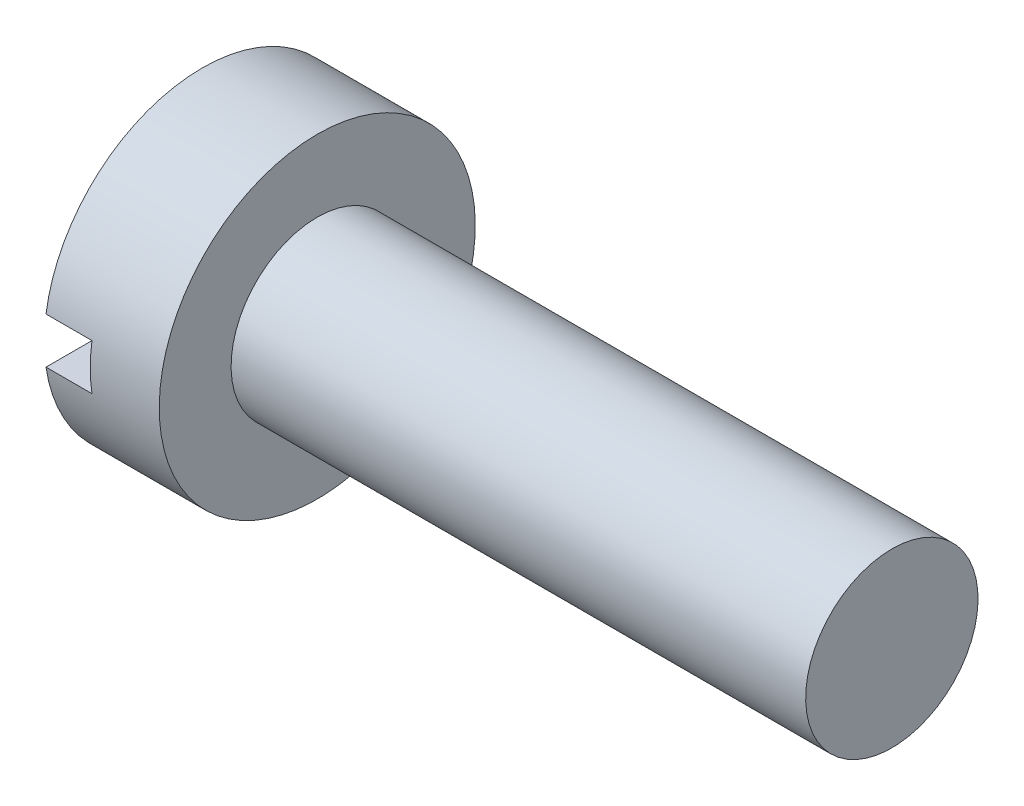
ISO-10303-21;
HEADER;
FILE_DESCRIPTION(('STEP AP214'),'2;1');
FILE_NAME('part.step','',(''),(''),'','','');
FILE_SCHEMA(('AUTOMOTIVE_DESIGN { 1 0 10303 214 1 1 1 1 }'));
ENDSEC;
DATA;
#1=APPLICATION_CONTEXT('core data for automotive mechanical design processes');
#2=APPLICATION_PROTOCOL_DEFINITION('international standard','automotive_design',2000,#1);
#3=PRODUCT_CONTEXT('',#1,'mechanical');
#4=PRODUCT('Part','Part','',(#3));
#5=PRODUCT_RELATED_PRODUCT_CATEGORY('part','',(#4));
#6=PRODUCT_DEFINITION_FORMATION('','',#4);
#7=PRODUCT_DEFINITION_CONTEXT('part definition',#1,'design');
#8=PRODUCT_DEFINITION('design','',#6,#7);
#9=PRODUCT_DEFINITION_SHAPE('','',#8);
#10=(LENGTH_UNIT() NAMED_UNIT(*) SI_UNIT(.MILLI.,.METRE.));
#11=(NAMED_UNIT(*) PLANE_ANGLE_UNIT() SI_UNIT($,.RADIAN.));
#12=(NAMED_UNIT(*) SI_UNIT($,.STERADIAN.) SOLID_ANGLE_UNIT());
#13=UNCERTAINTY_MEASURE_WITH_UNIT(LENGTH_MEASURE(1.E-05),#10,'distance_accuracy_value','');
#14=(GEOMETRIC_REPRESENTATION_CONTEXT(3) GLOBAL_UNCERTAINTY_ASSIGNED_CONTEXT((#13)) GLOBAL_UNIT_ASSIGNED_CONTEXT((#10,
#11,#12)) REPRESENTATION_CONTEXT('',''));
#15=CARTESIAN_POINT('',(0.,0.,0.));
#16=DIRECTION('',(0.,0.,1.));
#17=DIRECTION('',(1.,0.,0.));
#18=AXIS2_PLACEMENT_3D('',#15,#16,#17);
#19=CARTESIAN_POINT('',(0.,0.,0.));
#20=DIRECTION('',(-1.,0.,0.));
#21=DIRECTION('',(0.,-1.,0.));
#22=AXIS2_PLACEMENT_3D('',#19,#20,#21);
#23=PLANE('',#22);
#24=DIRECTION('',(0.,0.,-1.));
#25=VECTOR('',#24,1.);
#26=CARTESIAN_POINT('',(0.,0.399999999999997,-2.75));
#27=LINE('',#26,#25);
#28=CARTESIAN_POINT('',(0.,0.399999999999999,2.72075357208256));
#29=VERTEX_POINT('',#28);
#30=CARTESIAN_POINT('',(0.,0.399999999999997,-2.72075357208256));
#31=VERTEX_POINT('',#30);
#32=EDGE_CURVE('E83',#29,#31,#27,.T.);
#33=ORIENTED_EDGE('',*,*,#32,.F.);
#34=CARTESIAN_POINT('',(0.,0.,0.));
#35=DIRECTION('',(1.,0.,0.));
#36=DIRECTION('',(0.,1.,0.));
#37=AXIS2_PLACEMENT_3D('',#34,#35,#36);
#38=CIRCLE('',#37,2.75);
#39=EDGE_CURVE('E89',#31,#29,#38,.T.);
#40=ORIENTED_EDGE('',*,*,#39,.F.);
#41=EDGE_LOOP('',(#33,#40));
#42=FACE_BOUND('',#41,.T.);
#43=ADVANCED_FACE('F33',(#42),#23,.T.);
#44=DIRECTION('',(0.,0.,1.));
#45=VECTOR('',#44,1.);
#46=CARTESIAN_POINT('',(0.,-0.400000000000001,-2.75));
#47=LINE('',#46,#45);
#48=CARTESIAN_POINT('',(0.,-0.400000000000001,-2.72075357208256));
#49=VERTEX_POINT('',#48);
#50=CARTESIAN_POINT('',(0.,-0.399999999999999,2.72075357208256));
#51=VERTEX_POINT('',#50);
#52=EDGE_CURVE('E77',#49,#51,#47,.T.);
#53=ORIENTED_EDGE('',*,*,#52,.F.);
#54=EDGE_CURVE('E82',#51,#49,#38,.T.);
#55=ORIENTED_EDGE('',*,*,#54,.F.);
#56=EDGE_LOOP('',(#53,#55));
#57=FACE_BOUND('',#56,.T.);
#58=ADVANCED_FACE('F35',(#57),#23,.T.);
#59=CARTESIAN_POINT('',(12.,0.,0.));
#60=DIRECTION('',(1.,0.,0.));
#61=DIRECTION('',(0.,1.,0.));
#62=AXIS2_PLACEMENT_3D('',#59,#60,#61);
#63=CYLINDRICAL_SURFACE('',#62,2.75);
#64=DIRECTION('',(1.,0.,0.));
#65=VECTOR('',#64,1.);
#66=CARTESIAN_POINT('',(12.,0.399999999999997,-2.72075357208256));
#67=LINE('',#66,#65);
#68=CARTESIAN_POINT('',(0.8,0.399999999999997,-2.72075357208256));
#69=VERTEX_POINT('',#68);
#70=EDGE_CURVE('E11',#31,#69,#67,.T.);
#71=ORIENTED_EDGE('',*,*,#70,.F.);
#72=ORIENTED_EDGE('',*,*,#39,.T.);
#73=DIRECTION('',(1.,0.,0.));
#74=VECTOR('',#73,1.);
#75=CARTESIAN_POINT('',(12.,0.399999999999999,2.72075357208256));
#76=LINE('',#75,#74);
#77=CARTESIAN_POINT('',(0.8,0.399999999999999,2.72075357208256));
#78=VERTEX_POINT('',#77);
#79=EDGE_CURVE('E98',#78,#29,#76,.F.);
#80=ORIENTED_EDGE('',*,*,#79,.F.);
#81=CARTESIAN_POINT('',(0.8,0.,0.));
#82=DIRECTION('',(-1.,0.,0.));
#83=DIRECTION('',(0.,0.,1.));
#84=AXIS2_PLACEMENT_3D('',#81,#82,#83);
#85=CIRCLE('',#84,2.75);
#86=CARTESIAN_POINT('',(0.8,-0.399999999999999,2.72075357208256));
#87=VERTEX_POINT('',#86);
#88=EDGE_CURVE('E48',#78,#87,#85,.F.);
#89=ORIENTED_EDGE('',*,*,#88,.T.);
#90=DIRECTION('',(1.,0.,0.));
#91=VECTOR('',#90,1.);
#92=CARTESIAN_POINT('',(12.,-0.399999999999999,2.72075357208256));
#93=LINE('',#92,#91);
#94=EDGE_CURVE('E88',#51,#87,#93,.T.);
#95=ORIENTED_EDGE('',*,*,#94,.F.);
#96=ORIENTED_EDGE('',*,*,#54,.T.);
#97=DIRECTION('',(1.,0.,0.));
#98=VECTOR('',#97,1.);
#99=CARTESIAN_POINT('',(12.,-0.400000000000001,-2.72075357208256));
#100=LINE('',#99,#98);
#101=CARTESIAN_POINT('',(0.8,-0.400000000000001,-2.72075357208256));
#102=VERTEX_POINT('',#101);
#103=EDGE_CURVE('E41',#102,#49,#100,.F.);
#104=ORIENTED_EDGE('',*,*,#103,.F.);
#105=EDGE_CURVE('E56',#102,#69,#85,.F.);
#106=ORIENTED_EDGE('',*,*,#105,.T.);
#107=EDGE_LOOP('',(#71,#72,#80,#89,#95,#96,#104,#106));
#108=FACE_BOUND('',#107,.T.);
#109=CARTESIAN_POINT('',(2.,0.,0.));
#110=DIRECTION('',(1.,0.,0.));
#111=DIRECTION('',(0.,1.,0.));
#112=AXIS2_PLACEMENT_3D('',#109,#110,#111);
#113=CIRCLE('',#112,2.75);
#114=CARTESIAN_POINT('',(2.,2.75,0.));
#115=VERTEX_POINT('',#114);
#116=EDGE_CURVE('E93',#115,#115,#113,.T.);
#117=ORIENTED_EDGE('',*,*,#116,.F.);
#118=EDGE_LOOP('',(#117));
#119=FACE_BOUND('',#118,.T.);
#120=ADVANCED_FACE('F86',(#108,#119),#63,.T.);
#121=CARTESIAN_POINT('',(2.,2.75,0.));
#122=DIRECTION('',(1.,0.,0.));
#123=DIRECTION('',(0.,1.,0.));
#124=AXIS2_PLACEMENT_3D('',#121,#122,#123);
#125=PLANE('',#124);
#126=ORIENTED_EDGE('',*,*,#116,.T.);
#127=EDGE_LOOP('',(#126));
#128=FACE_BOUND('',#127,.T.);
#129=CARTESIAN_POINT('',(2.,0.,0.));
#130=DIRECTION('',(1.,0.,0.));
#131=DIRECTION('',(0.,1.,0.));
#132=AXIS2_PLACEMENT_3D('',#129,#130,#131);
#133=CIRCLE('',#132,1.5);
#134=CARTESIAN_POINT('',(2.,1.5,0.));
#135=VERTEX_POINT('',#134);
#136=EDGE_CURVE('E111',#135,#135,#133,.T.);
#137=ORIENTED_EDGE('',*,*,#136,.F.);
#138=EDGE_LOOP('',(#137));
#139=FACE_BOUND('',#138,.T.);
#140=ADVANCED_FACE('F118',(#128,#139),#125,.T.);
#141=CARTESIAN_POINT('',(12.,0.,0.));
#142=DIRECTION('',(1.,0.,0.));
#143=DIRECTION('',(0.,1.,0.));
#144=AXIS2_PLACEMENT_3D('',#141,#142,#143);
#145=CYLINDRICAL_SURFACE('',#144,1.5);
#146=ORIENTED_EDGE('',*,*,#136,.T.);
#147=EDGE_LOOP('',(#146));
#148=FACE_BOUND('',#147,.T.);
#149=CARTESIAN_POINT('',(12.,0.,0.));
#150=DIRECTION('',(1.,0.,0.));
#151=DIRECTION('',(0.,1.,0.));
#152=AXIS2_PLACEMENT_3D('',#149,#150,#151);
#153=CIRCLE('',#152,1.5);
#154=CARTESIAN_POINT('',(12.,1.5,0.));
#155=VERTEX_POINT('',#154);
#156=EDGE_CURVE('E109',#155,#155,#153,.T.);
#157=ORIENTED_EDGE('',*,*,#156,.F.);
#158=EDGE_LOOP('',(#157));
#159=FACE_BOUND('',#158,.T.);
#160=ADVANCED_FACE('F125',(#148,#159),#145,.T.);
#161=CARTESIAN_POINT('',(12.,1.5,0.));
#162=DIRECTION('',(1.,0.,0.));
#163=DIRECTION('',(0.,1.,0.));
#164=AXIS2_PLACEMENT_3D('',#161,#162,#163);
#165=PLANE('',#164);
#166=ORIENTED_EDGE('',*,*,#156,.T.);
#167=EDGE_LOOP('',(#166));
#168=FACE_BOUND('',#167,.T.);
#169=ADVANCED_FACE('F150',(#168),#165,.T.);
#170=CARTESIAN_POINT('',(0.8,0.399999999999997,-2.75));
#171=DIRECTION('',(0.,1.,0.));
#172=DIRECTION('',(0.,0.,1.));
#173=AXIS2_PLACEMENT_3D('',#170,#171,#172);
#174=PLANE('',#173);
#175=ORIENTED_EDGE('',*,*,#79,.T.);
#176=ORIENTED_EDGE('',*,*,#32,.T.);
#177=ORIENTED_EDGE('',*,*,#70,.T.);
#178=DIRECTION('',(0.,0.,-1.));
#179=VECTOR('',#178,1.);
#180=CARTESIAN_POINT('',(0.8,0.399999999999997,-2.75));
#181=LINE('',#180,#179);
#182=EDGE_CURVE('E105',#78,#69,#181,.T.);
#183=ORIENTED_EDGE('',*,*,#182,.F.);
#184=EDGE_LOOP('',(#175,#176,#177,#183));
#185=FACE_BOUND('',#184,.T.);
#186=ADVANCED_FACE('F145',(#185),#174,.F.);
#187=CARTESIAN_POINT('',(0.8,-0.400000000000001,-2.75));
#188=DIRECTION('',(0.,-1.,0.));
#189=DIRECTION('',(0.,0.,-1.));
#190=AXIS2_PLACEMENT_3D('',#187,#188,#189);
#191=PLANE('',#190);
#192=ORIENTED_EDGE('',*,*,#103,.T.);
#193=ORIENTED_EDGE('',*,*,#52,.T.);
#194=ORIENTED_EDGE('',*,*,#94,.T.);
#195=DIRECTION('',(0.,0.,1.));
#196=VECTOR('',#195,1.);
#197=CARTESIAN_POINT('',(0.8,-0.400000000000001,-2.75));
#198=LINE('',#197,#196);
#199=EDGE_CURVE('E78',#102,#87,#198,.T.);
#200=ORIENTED_EDGE('',*,*,#199,.F.);
#201=EDGE_LOOP('',(#192,#193,#194,#200));
#202=FACE_BOUND('',#201,.T.);
#203=ADVANCED_FACE('F76',(#202),#191,.F.);
#204=CARTESIAN_POINT('',(0.8,0.,0.));
#205=DIRECTION('',(-1.,0.,0.));
#206=DIRECTION('',(0.,0.,1.));
#207=AXIS2_PLACEMENT_3D('',#204,#205,#206);
#208=PLANE('',#207);
#209=ORIENTED_EDGE('',*,*,#199,.T.);
#210=ORIENTED_EDGE('',*,*,#88,.F.);
#211=ORIENTED_EDGE('',*,*,#182,.T.);
#212=ORIENTED_EDGE('',*,*,#105,.F.);
#213=EDGE_LOOP('',(#209,#210,#211,#212));
#214=FACE_BOUND('',#213,.T.);
#215=ADVANCED_FACE('F160',(#214),#208,.T.);
#216=CLOSED_SHELL('',(#43,#58,#120,#140,#160,#169,#186,#203,#215));
#217=MANIFOLD_SOLID_BREP('B2',#216);
#218=ADVANCED_BREP_SHAPE_REPRESENTATION('',(#18,#217),#14);
#219=SHAPE_DEFINITION_REPRESENTATION(#9,#218);
ENDSEC;
END-ISO-10303-21;
